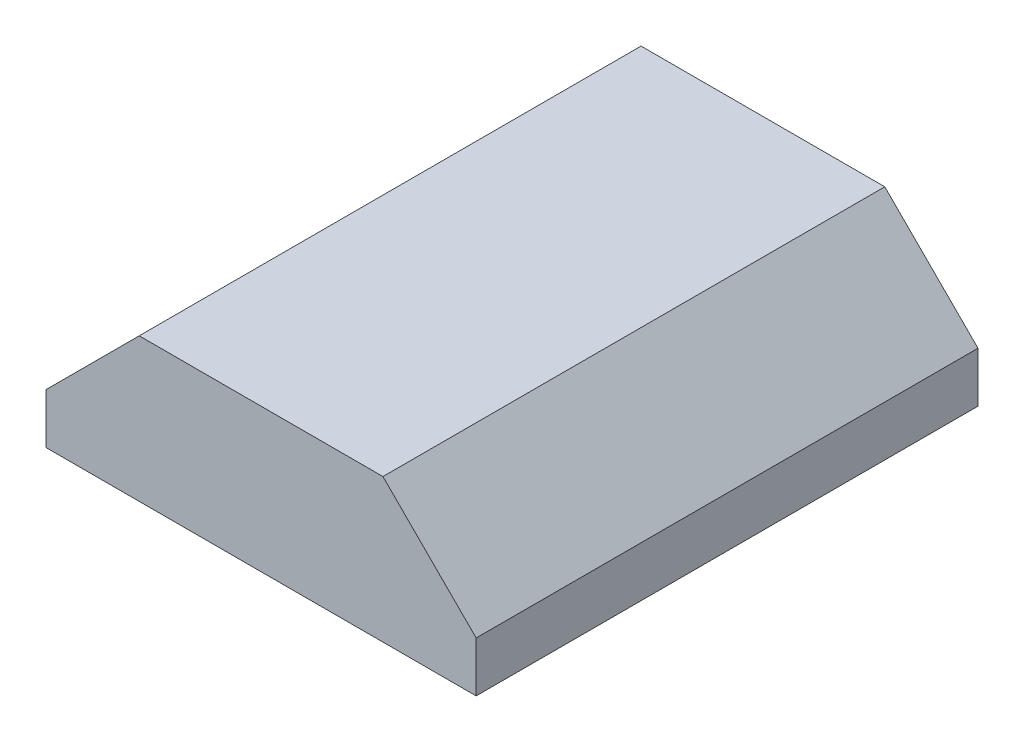
ISO-10303-21;
HEADER;
FILE_DESCRIPTION(('STEP AP214'),'2;1');
FILE_NAME('part.step','',(''),(''),'','','');
FILE_SCHEMA(('AUTOMOTIVE_DESIGN { 1 0 10303 214 1 1 1 1 }'));
ENDSEC;
DATA;
#1=APPLICATION_CONTEXT('core data for automotive mechanical design processes');
#2=APPLICATION_PROTOCOL_DEFINITION('international standard','automotive_design',2000,#1);
#3=PRODUCT_CONTEXT('',#1,'mechanical');
#4=PRODUCT('Part','Part','',(#3));
#5=PRODUCT_RELATED_PRODUCT_CATEGORY('part','',(#4));
#6=PRODUCT_DEFINITION_FORMATION('','',#4);
#7=PRODUCT_DEFINITION_CONTEXT('part definition',#1,'design');
#8=PRODUCT_DEFINITION('design','',#6,#7);
#9=PRODUCT_DEFINITION_SHAPE('','',#8);
#10=(LENGTH_UNIT() NAMED_UNIT(*) SI_UNIT(.MILLI.,.METRE.));
#11=(NAMED_UNIT(*) PLANE_ANGLE_UNIT() SI_UNIT($,.RADIAN.));
#12=(NAMED_UNIT(*) SI_UNIT($,.STERADIAN.) SOLID_ANGLE_UNIT());
#13=UNCERTAINTY_MEASURE_WITH_UNIT(LENGTH_MEASURE(1.E-05),#10,'distance_accuracy_value','');
#14=(GEOMETRIC_REPRESENTATION_CONTEXT(3) GLOBAL_UNCERTAINTY_ASSIGNED_CONTEXT((#13)) GLOBAL_UNIT_ASSIGNED_CONTEXT((#10,
#11,#12)) REPRESENTATION_CONTEXT('',''));
#15=CARTESIAN_POINT('',(0.,0.,0.));
#16=DIRECTION('',(0.,0.,1.));
#17=DIRECTION('',(1.,0.,0.));
#18=AXIS2_PLACEMENT_3D('',#15,#16,#17);
#19=CARTESIAN_POINT('',(3.4,1.80885878693797,14.));
#20=DIRECTION('',(0.707106781186549,0.707106781186546,0.));
#21=DIRECTION('',(-0.707106781186546,0.707106781186549,0.));
#22=AXIS2_PLACEMENT_3D('',#19,#20,#21);
#23=PLANE('',#22);
#24=DIRECTION('',(0.707106781186546,-0.707106781186549,0.));
#25=VECTOR('',#24,1.);
#26=CARTESIAN_POINT('',(3.4,1.80885878693797,0.));
#27=LINE('',#26,#25);
#28=CARTESIAN_POINT('',(3.4,1.80885878693797,0.));
#29=VERTEX_POINT('',#28);
#30=CARTESIAN_POINT('',(6.,-0.791141213062042,0.));
#31=VERTEX_POINT('',#30);
#32=EDGE_CURVE('E127',#29,#31,#27,.T.);
#33=ORIENTED_EDGE('',*,*,#32,.F.);
#34=DIRECTION('',(0.,0.,-1.));
#35=VECTOR('',#34,1.);
#36=CARTESIAN_POINT('',(3.4,1.80885878693797,14.));
#37=LINE('',#36,#35);
#38=CARTESIAN_POINT('',(3.4,1.80885878693797,14.));
#39=VERTEX_POINT('',#38);
#40=EDGE_CURVE('E11',#39,#29,#37,.T.);
#41=ORIENTED_EDGE('',*,*,#40,.F.);
#42=DIRECTION('',(0.707106781186546,-0.707106781186549,0.));
#43=VECTOR('',#42,1.);
#44=CARTESIAN_POINT('',(3.4,1.80885878693797,14.));
#45=LINE('',#44,#43);
#46=CARTESIAN_POINT('',(6.,-0.791141213062042,14.));
#47=VERTEX_POINT('',#46);
#48=EDGE_CURVE('E139',#39,#47,#45,.T.);
#49=ORIENTED_EDGE('',*,*,#48,.T.);
#50=DIRECTION('',(0.,0.,-1.));
#51=VECTOR('',#50,1.);
#52=CARTESIAN_POINT('',(6.,-0.791141213062042,14.));
#53=LINE('',#52,#51);
#54=EDGE_CURVE('E44',#47,#31,#53,.T.);
#55=ORIENTED_EDGE('',*,*,#54,.T.);
#56=EDGE_LOOP('',(#33,#41,#49,#55));
#57=FACE_BOUND('',#56,.T.);
#58=ADVANCED_FACE('F41',(#57),#23,.T.);
#59=CARTESIAN_POINT('',(3.4,1.80885878693797,14.));
#60=DIRECTION('',(0.,-1.,0.));
#61=DIRECTION('',(0.,0.,-1.));
#62=AXIS2_PLACEMENT_3D('',#59,#60,#61);
#63=PLANE('',#62);
#64=DIRECTION('',(-1.,0.,0.));
#65=VECTOR('',#64,1.);
#66=CARTESIAN_POINT('',(3.4,1.80885878693797,0.));
#67=LINE('',#66,#65);
#68=CARTESIAN_POINT('',(-3.4,1.80885878693797,0.));
#69=VERTEX_POINT('',#68);
#70=EDGE_CURVE('E80',#29,#69,#67,.T.);
#71=ORIENTED_EDGE('',*,*,#70,.T.);
#72=DIRECTION('',(0.,0.,-1.));
#73=VECTOR('',#72,1.);
#74=CARTESIAN_POINT('',(-3.4,1.80885878693797,14.));
#75=LINE('',#74,#73);
#76=CARTESIAN_POINT('',(-3.4,1.80885878693797,14.));
#77=VERTEX_POINT('',#76);
#78=EDGE_CURVE('E50',#77,#69,#75,.T.);
#79=ORIENTED_EDGE('',*,*,#78,.F.);
#80=DIRECTION('',(-1.,0.,0.));
#81=VECTOR('',#80,1.);
#82=CARTESIAN_POINT('',(3.4,1.80885878693797,14.));
#83=LINE('',#82,#81);
#84=EDGE_CURVE('E105',#39,#77,#83,.T.);
#85=ORIENTED_EDGE('',*,*,#84,.F.);
#86=ORIENTED_EDGE('',*,*,#40,.T.);
#87=EDGE_LOOP('',(#71,#79,#85,#86));
#88=FACE_BOUND('',#87,.T.);
#89=ADVANCED_FACE('F159',(#88),#63,.F.);
#90=CARTESIAN_POINT('',(-3.4,1.80885878693797,14.));
#91=DIRECTION('',(0.707106781186549,-0.707106781186546,0.));
#92=DIRECTION('',(0.707106781186546,0.707106781186549,0.));
#93=AXIS2_PLACEMENT_3D('',#90,#91,#92);
#94=PLANE('',#93);
#95=DIRECTION('',(-0.707106781186546,-0.707106781186549,0.));
#96=VECTOR('',#95,1.);
#97=CARTESIAN_POINT('',(-3.4,1.80885878693797,0.));
#98=LINE('',#97,#96);
#99=CARTESIAN_POINT('',(-6.,-0.791141213062042,0.));
#100=VERTEX_POINT('',#99);
#101=EDGE_CURVE('E112',#69,#100,#98,.T.);
#102=ORIENTED_EDGE('',*,*,#101,.T.);
#103=DIRECTION('',(0.,0.,-1.));
#104=VECTOR('',#103,1.);
#105=CARTESIAN_POINT('',(-6.,-0.791141213062042,14.));
#106=LINE('',#105,#104);
#107=CARTESIAN_POINT('',(-6.,-0.791141213062042,14.));
#108=VERTEX_POINT('',#107);
#109=EDGE_CURVE('E109',#108,#100,#106,.T.);
#110=ORIENTED_EDGE('',*,*,#109,.F.);
#111=DIRECTION('',(-0.707106781186546,-0.707106781186549,0.));
#112=VECTOR('',#111,1.);
#113=CARTESIAN_POINT('',(-3.4,1.80885878693797,14.));
#114=LINE('',#113,#112);
#115=EDGE_CURVE('E98',#77,#108,#114,.T.);
#116=ORIENTED_EDGE('',*,*,#115,.F.);
#117=ORIENTED_EDGE('',*,*,#78,.T.);
#118=EDGE_LOOP('',(#102,#110,#116,#117));
#119=FACE_BOUND('',#118,.T.);
#120=ADVANCED_FACE('F110',(#119),#94,.F.);
#121=CARTESIAN_POINT('',(-6.,-0.791141213062042,14.));
#122=DIRECTION('',(1.,0.,0.));
#123=DIRECTION('',(0.,0.,-1.));
#124=AXIS2_PLACEMENT_3D('',#121,#122,#123);
#125=PLANE('',#124);
#126=DIRECTION('',(0.,-1.,0.));
#127=VECTOR('',#126,1.);
#128=CARTESIAN_POINT('',(-6.,-0.791141213062042,0.));
#129=LINE('',#128,#127);
#130=CARTESIAN_POINT('',(-6.,-2.19114121306203,0.));
#131=VERTEX_POINT('',#130);
#132=EDGE_CURVE('E136',#100,#131,#129,.T.);
#133=ORIENTED_EDGE('',*,*,#132,.T.);
#134=DIRECTION('',(0.,0.,-1.));
#135=VECTOR('',#134,1.);
#136=CARTESIAN_POINT('',(-6.,-2.19114121306203,14.));
#137=LINE('',#136,#135);
#138=CARTESIAN_POINT('',(-6.,-2.19114121306203,14.));
#139=VERTEX_POINT('',#138);
#140=EDGE_CURVE('E115',#139,#131,#137,.T.);
#141=ORIENTED_EDGE('',*,*,#140,.F.);
#142=DIRECTION('',(0.,-1.,0.));
#143=VECTOR('',#142,1.);
#144=CARTESIAN_POINT('',(-6.,-0.791141213062042,14.));
#145=LINE('',#144,#143);
#146=EDGE_CURVE('E103',#108,#139,#145,.T.);
#147=ORIENTED_EDGE('',*,*,#146,.F.);
#148=ORIENTED_EDGE('',*,*,#109,.T.);
#149=EDGE_LOOP('',(#133,#141,#147,#148));
#150=FACE_BOUND('',#149,.T.);
#151=ADVANCED_FACE('F117',(#150),#125,.F.);
#152=CARTESIAN_POINT('',(-6.,-2.19114121306203,14.));
#153=DIRECTION('',(0.,1.,0.));
#154=DIRECTION('',(0.,0.,1.));
#155=AXIS2_PLACEMENT_3D('',#152,#153,#154);
#156=PLANE('',#155);
#157=DIRECTION('',(1.,0.,0.));
#158=VECTOR('',#157,1.);
#159=CARTESIAN_POINT('',(-6.,-2.19114121306203,0.));
#160=LINE('',#159,#158);
#161=CARTESIAN_POINT('',(6.,-2.19114121306203,0.));
#162=VERTEX_POINT('',#161);
#163=EDGE_CURVE('E133',#131,#162,#160,.T.);
#164=ORIENTED_EDGE('',*,*,#163,.T.);
#165=DIRECTION('',(0.,0.,-1.));
#166=VECTOR('',#165,1.);
#167=CARTESIAN_POINT('',(6.,-2.19114121306203,14.));
#168=LINE('',#167,#166);
#169=CARTESIAN_POINT('',(6.,-2.19114121306203,14.));
#170=VERTEX_POINT('',#169);
#171=EDGE_CURVE('E142',#170,#162,#168,.T.);
#172=ORIENTED_EDGE('',*,*,#171,.F.);
#173=DIRECTION('',(1.,0.,0.));
#174=VECTOR('',#173,1.);
#175=CARTESIAN_POINT('',(-6.,-2.19114121306203,14.));
#176=LINE('',#175,#174);
#177=EDGE_CURVE('E120',#139,#170,#176,.T.);
#178=ORIENTED_EDGE('',*,*,#177,.F.);
#179=ORIENTED_EDGE('',*,*,#140,.T.);
#180=EDGE_LOOP('',(#164,#172,#178,#179));
#181=FACE_BOUND('',#180,.T.);
#182=ADVANCED_FACE('F149',(#181),#156,.F.);
#183=CARTESIAN_POINT('',(6.,-0.791141213062042,14.));
#184=DIRECTION('',(1.,0.,0.));
#185=DIRECTION('',(0.,0.,-1.));
#186=AXIS2_PLACEMENT_3D('',#183,#184,#185);
#187=PLANE('',#186);
#188=DIRECTION('',(0.,-1.,0.));
#189=VECTOR('',#188,1.);
#190=CARTESIAN_POINT('',(6.,-0.791141213062042,0.));
#191=LINE('',#190,#189);
#192=EDGE_CURVE('E130',#31,#162,#191,.T.);
#193=ORIENTED_EDGE('',*,*,#192,.F.);
#194=ORIENTED_EDGE('',*,*,#54,.F.);
#195=DIRECTION('',(0.,-1.,0.));
#196=VECTOR('',#195,1.);
#197=CARTESIAN_POINT('',(6.,-0.791141213062042,14.));
#198=LINE('',#197,#196);
#199=EDGE_CURVE('E122',#47,#170,#198,.T.);
#200=ORIENTED_EDGE('',*,*,#199,.T.);
#201=ORIENTED_EDGE('',*,*,#171,.T.);
#202=EDGE_LOOP('',(#193,#194,#200,#201));
#203=FACE_BOUND('',#202,.T.);
#204=ADVANCED_FACE('F144',(#203),#187,.T.);
#205=CARTESIAN_POINT('',(0.,0.,14.));
#206=DIRECTION('',(0.,0.,-1.));
#207=DIRECTION('',(-1.,0.,0.));
#208=AXIS2_PLACEMENT_3D('',#205,#206,#207);
#209=PLANE('',#208);
#210=ORIENTED_EDGE('',*,*,#48,.F.);
#211=ORIENTED_EDGE('',*,*,#84,.T.);
#212=ORIENTED_EDGE('',*,*,#115,.T.);
#213=ORIENTED_EDGE('',*,*,#146,.T.);
#214=ORIENTED_EDGE('',*,*,#177,.T.);
#215=ORIENTED_EDGE('',*,*,#199,.F.);
#216=EDGE_LOOP('',(#210,#211,#212,#213,#214,#215));
#217=FACE_BOUND('',#216,.T.);
#218=ADVANCED_FACE('F101',(#217),#209,.F.);
#219=CARTESIAN_POINT('',(0.,0.,0.));
#220=DIRECTION('',(0.,0.,-1.));
#221=DIRECTION('',(-1.,0.,0.));
#222=AXIS2_PLACEMENT_3D('',#219,#220,#221);
#223=PLANE('',#222);
#224=ORIENTED_EDGE('',*,*,#32,.T.);
#225=ORIENTED_EDGE('',*,*,#192,.T.);
#226=ORIENTED_EDGE('',*,*,#163,.F.);
#227=ORIENTED_EDGE('',*,*,#132,.F.);
#228=ORIENTED_EDGE('',*,*,#101,.F.);
#229=ORIENTED_EDGE('',*,*,#70,.F.);
#230=EDGE_LOOP('',(#224,#225,#226,#227,#228,#229));
#231=FACE_BOUND('',#230,.T.);
#232=ADVANCED_FACE('F147',(#231),#223,.T.);
#233=CLOSED_SHELL('',(#58,#89,#120,#151,#182,#204,#218,#232));
#234=MANIFOLD_SOLID_BREP('B2',#233);
#235=ADVANCED_BREP_SHAPE_REPRESENTATION('',(#18,#234),#14);
#236=SHAPE_DEFINITION_REPRESENTATION(#9,#235);
ENDSEC;
END-ISO-10303-21;
